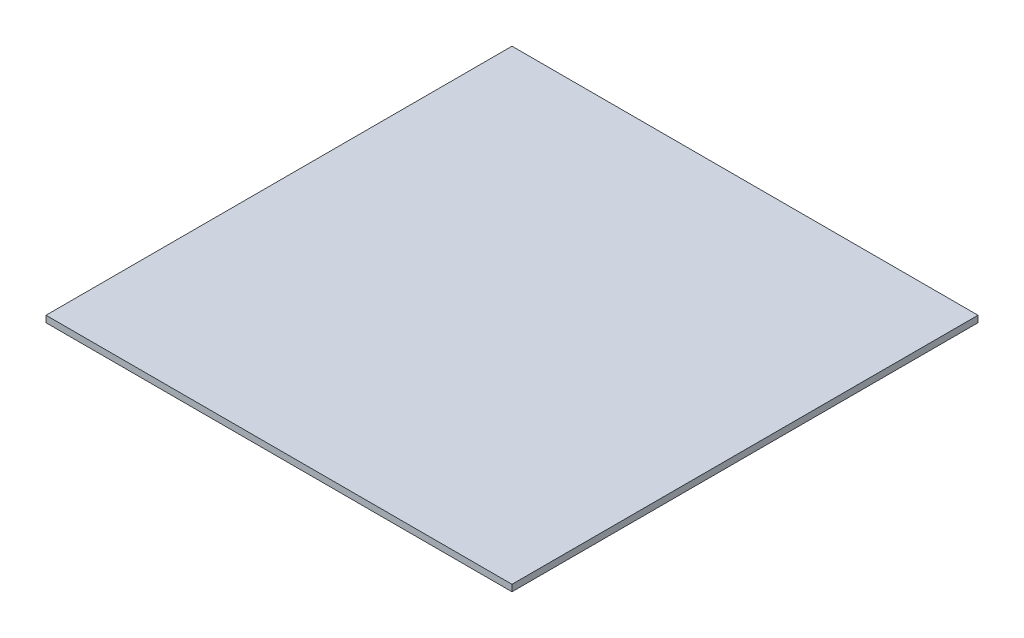
ISO-10303-21;
HEADER;
FILE_DESCRIPTION(('STEP AP214'),'2;1');
FILE_NAME('part.step','',(''),(''),'','','');
FILE_SCHEMA(('AUTOMOTIVE_DESIGN { 1 0 10303 214 1 1 1 1 }'));
ENDSEC;
DATA;
#1=APPLICATION_CONTEXT('core data for automotive mechanical design processes');
#2=APPLICATION_PROTOCOL_DEFINITION('international standard','automotive_design',2000,#1);
#3=PRODUCT_CONTEXT('',#1,'mechanical');
#4=PRODUCT('Part','Part','',(#3));
#5=PRODUCT_RELATED_PRODUCT_CATEGORY('part','',(#4));
#6=PRODUCT_DEFINITION_FORMATION('','',#4);
#7=PRODUCT_DEFINITION_CONTEXT('part definition',#1,'design');
#8=PRODUCT_DEFINITION('design','',#6,#7);
#9=PRODUCT_DEFINITION_SHAPE('','',#8);
#10=(LENGTH_UNIT() NAMED_UNIT(*) SI_UNIT(.MILLI.,.METRE.));
#11=(NAMED_UNIT(*) PLANE_ANGLE_UNIT() SI_UNIT($,.RADIAN.));
#12=(NAMED_UNIT(*) SI_UNIT($,.STERADIAN.) SOLID_ANGLE_UNIT());
#13=UNCERTAINTY_MEASURE_WITH_UNIT(LENGTH_MEASURE(1.E-05),#10,'distance_accuracy_value','');
#14=(GEOMETRIC_REPRESENTATION_CONTEXT(3) GLOBAL_UNCERTAINTY_ASSIGNED_CONTEXT((#13)) GLOBAL_UNIT_ASSIGNED_CONTEXT((#10,
#11,#12)) REPRESENTATION_CONTEXT('',''));
#15=CARTESIAN_POINT('',(0.,0.,0.));
#16=DIRECTION('',(0.,0.,1.));
#17=DIRECTION('',(1.,0.,0.));
#18=AXIS2_PLACEMENT_3D('',#15,#16,#17);
#19=CARTESIAN_POINT('',(107.,3.,107.));
#20=DIRECTION('',(-1.,0.,0.));
#21=DIRECTION('',(0.,0.,1.));
#22=AXIS2_PLACEMENT_3D('',#19,#20,#21);
#23=PLANE('',#22);
#24=DIRECTION('',(0.,0.,-1.));
#25=VECTOR('',#24,1.);
#26=CARTESIAN_POINT('',(107.,0.,107.));
#27=LINE('',#26,#25);
#28=CARTESIAN_POINT('',(107.,0.,107.));
#29=VERTEX_POINT('',#28);
#30=CARTESIAN_POINT('',(107.,0.,-107.));
#31=VERTEX_POINT('',#30);
#32=EDGE_CURVE('E98',#29,#31,#27,.T.);
#33=ORIENTED_EDGE('',*,*,#32,.T.);
#34=DIRECTION('',(0.,-1.,0.));
#35=VECTOR('',#34,1.);
#36=CARTESIAN_POINT('',(107.,3.,-107.));
#37=LINE('',#36,#35);
#38=CARTESIAN_POINT('',(107.,3.,-107.));
#39=VERTEX_POINT('',#38);
#40=EDGE_CURVE('E11',#39,#31,#37,.T.);
#41=ORIENTED_EDGE('',*,*,#40,.F.);
#42=DIRECTION('',(0.,0.,-1.));
#43=VECTOR('',#42,1.);
#44=CARTESIAN_POINT('',(107.,3.,107.));
#45=LINE('',#44,#43);
#46=CARTESIAN_POINT('',(107.,3.,107.));
#47=VERTEX_POINT('',#46);
#48=EDGE_CURVE('E86',#47,#39,#45,.T.);
#49=ORIENTED_EDGE('',*,*,#48,.F.);
#50=DIRECTION('',(0.,-1.,0.));
#51=VECTOR('',#50,1.);
#52=CARTESIAN_POINT('',(107.,3.,107.));
#53=LINE('',#52,#51);
#54=EDGE_CURVE('E94',#47,#29,#53,.T.);
#55=ORIENTED_EDGE('',*,*,#54,.T.);
#56=EDGE_LOOP('',(#33,#41,#49,#55));
#57=FACE_BOUND('',#56,.T.);
#58=ADVANCED_FACE('F35',(#57),#23,.F.);
#59=CARTESIAN_POINT('',(-107.,3.,-107.));
#60=DIRECTION('',(0.,0.,1.));
#61=DIRECTION('',(1.,0.,0.));
#62=AXIS2_PLACEMENT_3D('',#59,#60,#61);
#63=PLANE('',#62);
#64=DIRECTION('',(-1.,0.,0.));
#65=VECTOR('',#64,1.);
#66=CARTESIAN_POINT('',(-107.,0.,-107.));
#67=LINE('',#66,#65);
#68=CARTESIAN_POINT('',(-107.,0.,-107.));
#69=VERTEX_POINT('',#68);
#70=EDGE_CURVE('E90',#31,#69,#67,.T.);
#71=ORIENTED_EDGE('',*,*,#70,.T.);
#72=DIRECTION('',(0.,-1.,0.));
#73=VECTOR('',#72,1.);
#74=CARTESIAN_POINT('',(-107.,3.,-107.));
#75=LINE('',#74,#73);
#76=CARTESIAN_POINT('',(-107.,3.,-107.));
#77=VERTEX_POINT('',#76);
#78=EDGE_CURVE('E43',#77,#69,#75,.T.);
#79=ORIENTED_EDGE('',*,*,#78,.F.);
#80=DIRECTION('',(-1.,0.,0.));
#81=VECTOR('',#80,1.);
#82=CARTESIAN_POINT('',(-107.,3.,-107.));
#83=LINE('',#82,#81);
#84=EDGE_CURVE('E81',#39,#77,#83,.T.);
#85=ORIENTED_EDGE('',*,*,#84,.F.);
#86=ORIENTED_EDGE('',*,*,#40,.T.);
#87=EDGE_LOOP('',(#71,#79,#85,#86));
#88=FACE_BOUND('',#87,.T.);
#89=ADVANCED_FACE('F89',(#88),#63,.F.);
#90=CARTESIAN_POINT('',(-107.,3.,107.));
#91=DIRECTION('',(1.,0.,0.));
#92=DIRECTION('',(0.,0.,-1.));
#93=AXIS2_PLACEMENT_3D('',#90,#91,#92);
#94=PLANE('',#93);
#95=DIRECTION('',(0.,0.,1.));
#96=VECTOR('',#95,1.);
#97=CARTESIAN_POINT('',(-107.,0.,107.));
#98=LINE('',#97,#96);
#99=CARTESIAN_POINT('',(-107.,0.,107.));
#100=VERTEX_POINT('',#99);
#101=EDGE_CURVE('E68',#69,#100,#98,.T.);
#102=ORIENTED_EDGE('',*,*,#101,.T.);
#103=DIRECTION('',(0.,-1.,0.));
#104=VECTOR('',#103,1.);
#105=CARTESIAN_POINT('',(-107.,3.,107.));
#106=LINE('',#105,#104);
#107=CARTESIAN_POINT('',(-107.,3.,107.));
#108=VERTEX_POINT('',#107);
#109=EDGE_CURVE('E91',#108,#100,#106,.T.);
#110=ORIENTED_EDGE('',*,*,#109,.F.);
#111=DIRECTION('',(0.,0.,1.));
#112=VECTOR('',#111,1.);
#113=CARTESIAN_POINT('',(-107.,3.,107.));
#114=LINE('',#113,#112);
#115=EDGE_CURVE('E84',#77,#108,#114,.T.);
#116=ORIENTED_EDGE('',*,*,#115,.F.);
#117=ORIENTED_EDGE('',*,*,#78,.T.);
#118=EDGE_LOOP('',(#102,#110,#116,#117));
#119=FACE_BOUND('',#118,.T.);
#120=ADVANCED_FACE('F92',(#119),#94,.F.);
#121=CARTESIAN_POINT('',(-107.,3.,107.));
#122=DIRECTION('',(0.,0.,-1.));
#123=DIRECTION('',(-1.,0.,0.));
#124=AXIS2_PLACEMENT_3D('',#121,#122,#123);
#125=PLANE('',#124);
#126=DIRECTION('',(1.,0.,0.));
#127=VECTOR('',#126,1.);
#128=CARTESIAN_POINT('',(-107.,0.,107.));
#129=LINE('',#128,#127);
#130=EDGE_CURVE('E74',#100,#29,#129,.T.);
#131=ORIENTED_EDGE('',*,*,#130,.T.);
#132=ORIENTED_EDGE('',*,*,#54,.F.);
#133=DIRECTION('',(1.,0.,0.));
#134=VECTOR('',#133,1.);
#135=CARTESIAN_POINT('',(-107.,3.,107.));
#136=LINE('',#135,#134);
#137=EDGE_CURVE('E51',#108,#47,#136,.T.);
#138=ORIENTED_EDGE('',*,*,#137,.F.);
#139=ORIENTED_EDGE('',*,*,#109,.T.);
#140=EDGE_LOOP('',(#131,#132,#138,#139));
#141=FACE_BOUND('',#140,.T.);
#142=ADVANCED_FACE('F105',(#141),#125,.F.);
#143=CARTESIAN_POINT('',(0.,3.,0.));
#144=DIRECTION('',(0.,-1.,0.));
#145=DIRECTION('',(0.,0.,-1.));
#146=AXIS2_PLACEMENT_3D('',#143,#144,#145);
#147=PLANE('',#146);
#148=ORIENTED_EDGE('',*,*,#48,.T.);
#149=ORIENTED_EDGE('',*,*,#84,.T.);
#150=ORIENTED_EDGE('',*,*,#115,.T.);
#151=ORIENTED_EDGE('',*,*,#137,.T.);
#152=EDGE_LOOP('',(#148,#149,#150,#151));
#153=FACE_BOUND('',#152,.T.);
#154=ADVANCED_FACE('F82',(#153),#147,.F.);
#155=CARTESIAN_POINT('',(0.,0.,0.));
#156=DIRECTION('',(0.,-1.,0.));
#157=DIRECTION('',(0.,0.,-1.));
#158=AXIS2_PLACEMENT_3D('',#155,#156,#157);
#159=PLANE('',#158);
#160=ORIENTED_EDGE('',*,*,#32,.F.);
#161=ORIENTED_EDGE('',*,*,#130,.F.);
#162=ORIENTED_EDGE('',*,*,#101,.F.);
#163=ORIENTED_EDGE('',*,*,#70,.F.);
#164=EDGE_LOOP('',(#160,#161,#162,#163));
#165=FACE_BOUND('',#164,.T.);
#166=ADVANCED_FACE('F108',(#165),#159,.T.);
#167=CLOSED_SHELL('',(#58,#89,#120,#142,#154,#166));
#168=MANIFOLD_SOLID_BREP('B2',#167);
#169=ADVANCED_BREP_SHAPE_REPRESENTATION('',(#18,#168),#14);
#170=SHAPE_DEFINITION_REPRESENTATION(#9,#169);
ENDSEC;
END-ISO-10303-21;
